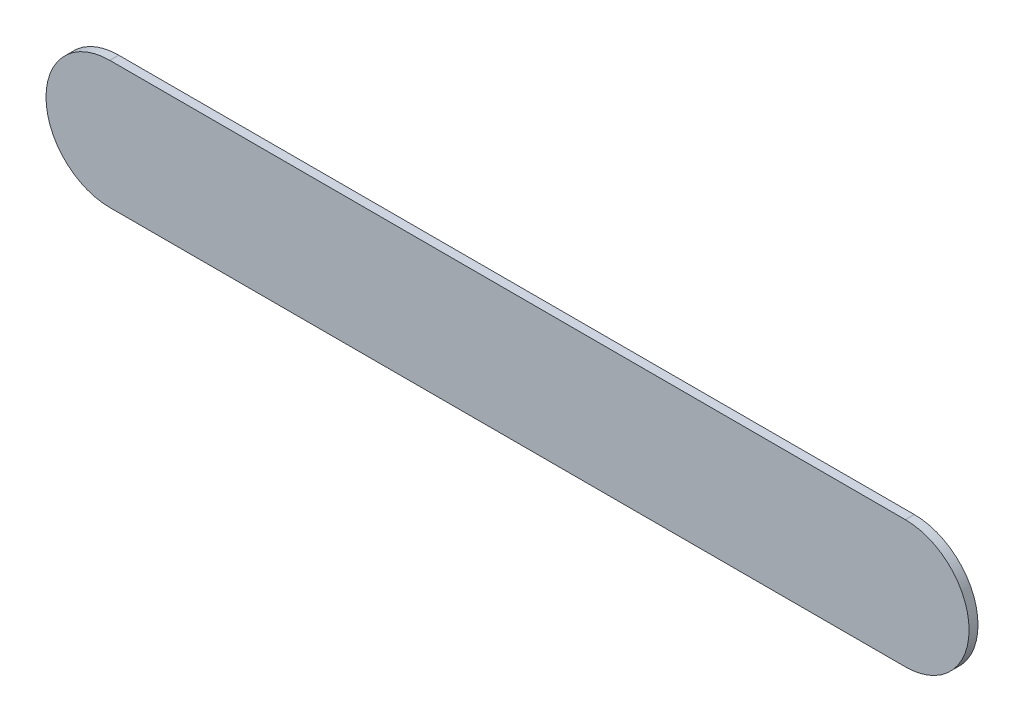
ISO-10303-21;
HEADER;
FILE_DESCRIPTION(('STEP AP214'),'2;1');
FILE_NAME('part.step','',(''),(''),'','','');
FILE_SCHEMA(('AUTOMOTIVE_DESIGN { 1 0 10303 214 1 1 1 1 }'));
ENDSEC;
DATA;
#1=APPLICATION_CONTEXT('core data for automotive mechanical design processes');
#2=APPLICATION_PROTOCOL_DEFINITION('international standard','automotive_design',2000,#1);
#3=PRODUCT_CONTEXT('',#1,'mechanical');
#4=PRODUCT('Part','Part','',(#3));
#5=PRODUCT_RELATED_PRODUCT_CATEGORY('part','',(#4));
#6=PRODUCT_DEFINITION_FORMATION('','',#4);
#7=PRODUCT_DEFINITION_CONTEXT('part definition',#1,'design');
#8=PRODUCT_DEFINITION('design','',#6,#7);
#9=PRODUCT_DEFINITION_SHAPE('','',#8);
#10=(LENGTH_UNIT() NAMED_UNIT(*) SI_UNIT(.MILLI.,.METRE.));
#11=(NAMED_UNIT(*) PLANE_ANGLE_UNIT() SI_UNIT($,.RADIAN.));
#12=(NAMED_UNIT(*) SI_UNIT($,.STERADIAN.) SOLID_ANGLE_UNIT());
#13=UNCERTAINTY_MEASURE_WITH_UNIT(LENGTH_MEASURE(1.E-05),#10,'distance_accuracy_value','');
#14=(GEOMETRIC_REPRESENTATION_CONTEXT(3) GLOBAL_UNCERTAINTY_ASSIGNED_CONTEXT((#13)) GLOBAL_UNIT_ASSIGNED_CONTEXT((#10,
#11,#12)) REPRESENTATION_CONTEXT('',''));
#15=CARTESIAN_POINT('',(0.,0.,0.));
#16=DIRECTION('',(0.,0.,1.));
#17=DIRECTION('',(1.,0.,0.));
#18=AXIS2_PLACEMENT_3D('',#15,#16,#17);
#19=CARTESIAN_POINT('',(148.05,-56.63,1.635));
#20=DIRECTION('',(0.,0.,1.));
#21=DIRECTION('',(1.,0.,0.));
#22=AXIS2_PLACEMENT_3D('',#19,#20,#21);
#23=PLANE('',#22);
#24=DIRECTION('',(1.,0.,0.));
#25=VECTOR('',#24,1.);
#26=CARTESIAN_POINT('',(148.05,-56.63,1.635));
#27=LINE('',#26,#25);
#28=CARTESIAN_POINT('',(148.05,-56.63,1.635));
#29=VERTEX_POINT('',#28);
#30=CARTESIAN_POINT('',(151.17,-56.63,1.635));
#31=VERTEX_POINT('',#30);
#32=EDGE_CURVE('E83',#29,#31,#27,.T.);
#33=ORIENTED_EDGE('',*,*,#32,.T.);
#34=CARTESIAN_POINT('',(151.17,-56.38,1.635));
#35=DIRECTION('',(0.,0.,1.));
#36=DIRECTION('',(0.,-1.,0.));
#37=AXIS2_PLACEMENT_3D('',#34,#35,#36);
#38=CIRCLE('',#37,0.25);
#39=CARTESIAN_POINT('',(151.17,-56.13,1.635));
#40=VERTEX_POINT('',#39);
#41=EDGE_CURVE('E103',#31,#40,#38,.T.);
#42=ORIENTED_EDGE('',*,*,#41,.T.);
#43=DIRECTION('',(-1.,0.,0.));
#44=VECTOR('',#43,1.);
#45=CARTESIAN_POINT('',(151.17,-56.13,1.635));
#46=LINE('',#45,#44);
#47=CARTESIAN_POINT('',(148.05,-56.13,1.635));
#48=VERTEX_POINT('',#47);
#49=EDGE_CURVE('E75',#40,#48,#46,.T.);
#50=ORIENTED_EDGE('',*,*,#49,.T.);
#51=CARTESIAN_POINT('',(148.05,-56.38,1.635));
#52=DIRECTION('',(0.,0.,1.));
#53=DIRECTION('',(0.,1.,0.));
#54=AXIS2_PLACEMENT_3D('',#51,#52,#53);
#55=CIRCLE('',#54,0.25);
#56=EDGE_CURVE('E11',#48,#29,#55,.T.);
#57=ORIENTED_EDGE('',*,*,#56,.T.);
#58=EDGE_LOOP('',(#33,#42,#50,#57));
#59=FACE_BOUND('',#58,.T.);
#60=ADVANCED_FACE('F17',(#59),#23,.T.);
#61=CARTESIAN_POINT('',(148.05,-56.63,1.6));
#62=DIRECTION('',(0.,0.,1.));
#63=DIRECTION('',(1.,0.,0.));
#64=AXIS2_PLACEMENT_3D('',#61,#62,#63);
#65=PLANE('',#64);
#66=CARTESIAN_POINT('',(148.05,-56.38,1.6));
#67=DIRECTION('',(0.,0.,1.));
#68=DIRECTION('',(0.,1.,0.));
#69=AXIS2_PLACEMENT_3D('',#66,#67,#68);
#70=CIRCLE('',#69,0.25);
#71=CARTESIAN_POINT('',(148.05,-56.13,1.6));
#72=VERTEX_POINT('',#71);
#73=CARTESIAN_POINT('',(148.05,-56.63,1.6));
#74=VERTEX_POINT('',#73);
#75=EDGE_CURVE('E26',#72,#74,#70,.T.);
#76=ORIENTED_EDGE('',*,*,#75,.F.);
#77=DIRECTION('',(-1.,0.,0.));
#78=VECTOR('',#77,1.);
#79=CARTESIAN_POINT('',(151.17,-56.13,1.6));
#80=LINE('',#79,#78);
#81=CARTESIAN_POINT('',(151.17,-56.13,1.6));
#82=VERTEX_POINT('',#81);
#83=EDGE_CURVE('E100',#82,#72,#80,.T.);
#84=ORIENTED_EDGE('',*,*,#83,.F.);
#85=CARTESIAN_POINT('',(151.17,-56.38,1.6));
#86=DIRECTION('',(0.,0.,1.));
#87=DIRECTION('',(0.,-1.,0.));
#88=AXIS2_PLACEMENT_3D('',#85,#86,#87);
#89=CIRCLE('',#88,0.25);
#90=CARTESIAN_POINT('',(151.17,-56.63,1.6));
#91=VERTEX_POINT('',#90);
#92=EDGE_CURVE('E85',#91,#82,#89,.T.);
#93=ORIENTED_EDGE('',*,*,#92,.F.);
#94=DIRECTION('',(1.,0.,0.));
#95=VECTOR('',#94,1.);
#96=CARTESIAN_POINT('',(148.05,-56.63,1.6));
#97=LINE('',#96,#95);
#98=EDGE_CURVE('E81',#74,#91,#97,.T.);
#99=ORIENTED_EDGE('',*,*,#98,.F.);
#100=EDGE_LOOP('',(#76,#84,#93,#99));
#101=FACE_BOUND('',#100,.T.);
#102=ADVANCED_FACE('F19',(#101),#65,.F.);
#103=CARTESIAN_POINT('',(148.05,-56.38,1.6));
#104=DIRECTION('',(0.,0.,-1.));
#105=DIRECTION('',(0.,1.,0.));
#106=AXIS2_PLACEMENT_3D('',#103,#104,#105);
#107=CYLINDRICAL_SURFACE('',#106,0.25);
#108=ORIENTED_EDGE('',*,*,#75,.T.);
#109=DIRECTION('',(0.,0.,1.));
#110=VECTOR('',#109,1.);
#111=CARTESIAN_POINT('',(148.05,-56.63,1.6));
#112=LINE('',#111,#110);
#113=EDGE_CURVE('E69',#74,#29,#112,.T.);
#114=ORIENTED_EDGE('',*,*,#113,.T.);
#115=ORIENTED_EDGE('',*,*,#56,.F.);
#116=DIRECTION('',(0.,0.,1.));
#117=VECTOR('',#116,1.);
#118=CARTESIAN_POINT('',(148.05,-56.13,1.6));
#119=LINE('',#118,#117);
#120=EDGE_CURVE('E72',#72,#48,#119,.T.);
#121=ORIENTED_EDGE('',*,*,#120,.F.);
#122=EDGE_LOOP('',(#108,#114,#115,#121));
#123=FACE_BOUND('',#122,.T.);
#124=ADVANCED_FACE('F68',(#123),#107,.T.);
#125=CARTESIAN_POINT('',(151.17,-56.13,1.6));
#126=DIRECTION('',(0.,-1.,0.));
#127=DIRECTION('',(0.,0.,-1.));
#128=AXIS2_PLACEMENT_3D('',#125,#126,#127);
#129=PLANE('',#128);
#130=ORIENTED_EDGE('',*,*,#83,.T.);
#131=ORIENTED_EDGE('',*,*,#120,.T.);
#132=ORIENTED_EDGE('',*,*,#49,.F.);
#133=DIRECTION('',(0.,0.,1.));
#134=VECTOR('',#133,1.);
#135=CARTESIAN_POINT('',(151.17,-56.13,1.6));
#136=LINE('',#135,#134);
#137=EDGE_CURVE('E108',#82,#40,#136,.T.);
#138=ORIENTED_EDGE('',*,*,#137,.F.);
#139=EDGE_LOOP('',(#130,#131,#132,#138));
#140=FACE_BOUND('',#139,.T.);
#141=ADVANCED_FACE('F120',(#140),#129,.F.);
#142=CARTESIAN_POINT('',(151.17,-56.38,1.6));
#143=DIRECTION('',(0.,0.,-1.));
#144=DIRECTION('',(0.,-1.,0.));
#145=AXIS2_PLACEMENT_3D('',#142,#143,#144);
#146=CYLINDRICAL_SURFACE('',#145,0.25);
#147=ORIENTED_EDGE('',*,*,#92,.T.);
#148=ORIENTED_EDGE('',*,*,#137,.T.);
#149=ORIENTED_EDGE('',*,*,#41,.F.);
#150=DIRECTION('',(0.,0.,1.));
#151=VECTOR('',#150,1.);
#152=CARTESIAN_POINT('',(151.17,-56.63,1.6));
#153=LINE('',#152,#151);
#154=EDGE_CURVE('E90',#91,#31,#153,.T.);
#155=ORIENTED_EDGE('',*,*,#154,.F.);
#156=EDGE_LOOP('',(#147,#148,#149,#155));
#157=FACE_BOUND('',#156,.T.);
#158=ADVANCED_FACE('F122',(#157),#146,.T.);
#159=CARTESIAN_POINT('',(148.05,-56.63,1.6));
#160=DIRECTION('',(0.,1.,0.));
#161=DIRECTION('',(1.,0.,0.));
#162=AXIS2_PLACEMENT_3D('',#159,#160,#161);
#163=PLANE('',#162);
#164=ORIENTED_EDGE('',*,*,#98,.T.);
#165=ORIENTED_EDGE('',*,*,#154,.T.);
#166=ORIENTED_EDGE('',*,*,#32,.F.);
#167=ORIENTED_EDGE('',*,*,#113,.F.);
#168=EDGE_LOOP('',(#164,#165,#166,#167));
#169=FACE_BOUND('',#168,.T.);
#170=ADVANCED_FACE('F79',(#169),#163,.F.);
#171=CLOSED_SHELL('',(#60,#102,#124,#141,#158,#170));
#172=MANIFOLD_SOLID_BREP('B1',#171);
#173=ADVANCED_BREP_SHAPE_REPRESENTATION('',(#18,#172),#14);
#174=SHAPE_DEFINITION_REPRESENTATION(#9,#173);
ENDSEC;
END-ISO-10303-21;
